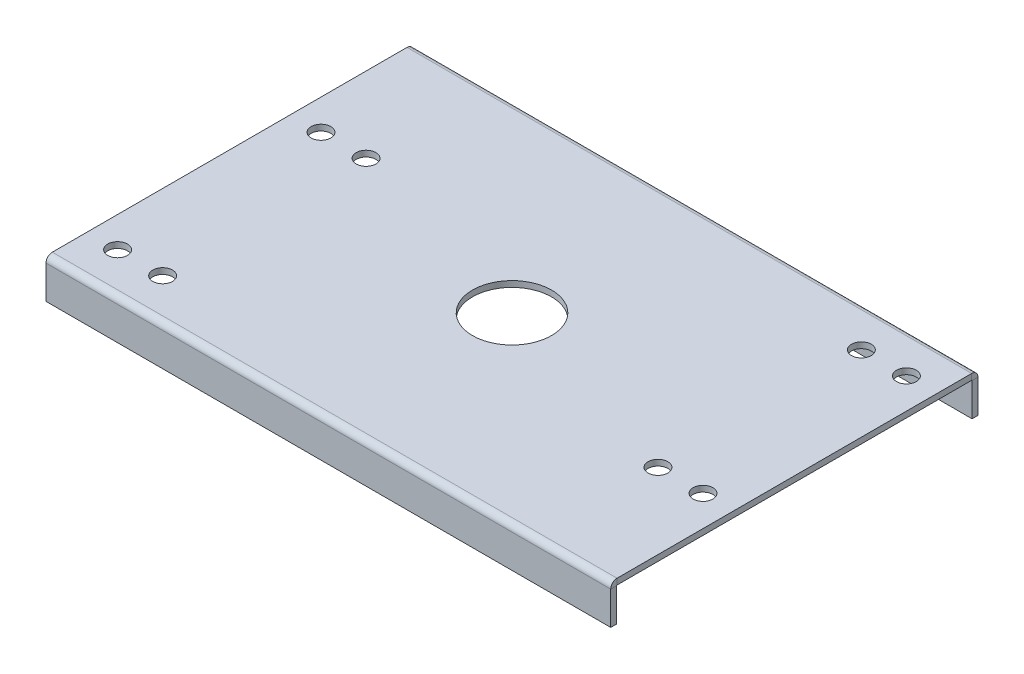
ISO-10303-21;
HEADER;
FILE_DESCRIPTION(('STEP AP214'),'2;1');
FILE_NAME('part.step','',(''),(''),'','','');
FILE_SCHEMA(('AUTOMOTIVE_DESIGN { 1 0 10303 214 1 1 1 1 }'));
ENDSEC;
DATA;
#1=APPLICATION_CONTEXT('core data for automotive mechanical design processes');
#2=APPLICATION_PROTOCOL_DEFINITION('international standard','automotive_design',2000,#1);
#3=PRODUCT_CONTEXT('',#1,'mechanical');
#4=PRODUCT('Part','Part','',(#3));
#5=PRODUCT_RELATED_PRODUCT_CATEGORY('part','',(#4));
#6=PRODUCT_DEFINITION_FORMATION('','',#4);
#7=PRODUCT_DEFINITION_CONTEXT('part definition',#1,'design');
#8=PRODUCT_DEFINITION('design','',#6,#7);
#9=PRODUCT_DEFINITION_SHAPE('','',#8);
#10=(LENGTH_UNIT() NAMED_UNIT(*) SI_UNIT(.MILLI.,.METRE.));
#11=(NAMED_UNIT(*) PLANE_ANGLE_UNIT() SI_UNIT($,.RADIAN.));
#12=(NAMED_UNIT(*) SI_UNIT($,.STERADIAN.) SOLID_ANGLE_UNIT());
#13=UNCERTAINTY_MEASURE_WITH_UNIT(LENGTH_MEASURE(1.E-05),#10,'distance_accuracy_value','');
#14=(GEOMETRIC_REPRESENTATION_CONTEXT(3) GLOBAL_UNCERTAINTY_ASSIGNED_CONTEXT((#13)) GLOBAL_UNIT_ASSIGNED_CONTEXT((#10,
#11,#12)) REPRESENTATION_CONTEXT('',''));
#15=CARTESIAN_POINT('',(0.,0.,0.));
#16=DIRECTION('',(0.,0.,1.));
#17=DIRECTION('',(1.,0.,0.));
#18=AXIS2_PLACEMENT_3D('',#15,#16,#17);
#19=CARTESIAN_POINT('',(0.,-1.5,0.));
#20=DIRECTION('',(0.,-1.,0.));
#21=DIRECTION('',(0.,0.,-1.));
#22=AXIS2_PLACEMENT_3D('',#19,#20,#21);
#23=PLANE('',#22);
#24=CARTESIAN_POINT('',(-63.775,-1.5,36.1));
#25=DIRECTION('',(0.,1.,0.));
#26=DIRECTION('',(0.,0.,1.));
#27=AXIS2_PLACEMENT_3D('',#24,#25,#26);
#28=CIRCLE('',#27,2.5);
#29=CARTESIAN_POINT('',(-63.775,-1.5,38.6));
#30=VERTEX_POINT('',#29);
#31=EDGE_CURVE('E398',#30,#30,#28,.T.);
#32=ORIENTED_EDGE('',*,*,#31,.T.);
#33=EDGE_LOOP('',(#32));
#34=FACE_BOUND('',#33,.T.);
#35=CARTESIAN_POINT('',(52.3650000000005,-1.5,15.41));
#36=DIRECTION('',(0.,1.,0.));
#37=DIRECTION('',(0.,0.,1.));
#38=AXIS2_PLACEMENT_3D('',#35,#36,#37);
#39=CIRCLE('',#38,2.5);
#40=CARTESIAN_POINT('',(52.3650000000005,-1.5,17.91));
#41=VERTEX_POINT('',#40);
#42=EDGE_CURVE('E387',#41,#41,#39,.T.);
#43=ORIENTED_EDGE('',*,*,#42,.T.);
#44=EDGE_LOOP('',(#43));
#45=FACE_BOUND('',#44,.T.);
#46=CARTESIAN_POINT('',(63.7750000000005,-1.5,15.41));
#47=DIRECTION('',(0.,1.,0.));
#48=DIRECTION('',(0.,0.,1.));
#49=AXIS2_PLACEMENT_3D('',#46,#47,#48);
#50=CIRCLE('',#49,2.50000000000001);
#51=CARTESIAN_POINT('',(63.7750000000005,-1.5,17.91));
#52=VERTEX_POINT('',#51);
#53=EDGE_CURVE('E386',#52,#52,#50,.T.);
#54=ORIENTED_EDGE('',*,*,#53,.T.);
#55=EDGE_LOOP('',(#54));
#56=FACE_BOUND('',#55,.T.);
#57=CARTESIAN_POINT('',(52.365,-1.5,-36.1));
#58=DIRECTION('',(0.,1.,0.));
#59=DIRECTION('',(0.,0.,1.));
#60=AXIS2_PLACEMENT_3D('',#57,#58,#59);
#61=CIRCLE('',#60,2.5);
#62=CARTESIAN_POINT('',(52.365,-1.5,-33.6));
#63=VERTEX_POINT('',#62);
#64=EDGE_CURVE('E380',#63,#63,#61,.T.);
#65=ORIENTED_EDGE('',*,*,#64,.T.);
#66=EDGE_LOOP('',(#65));
#67=FACE_BOUND('',#66,.T.);
#68=CARTESIAN_POINT('',(-52.3650000000002,-1.5,-15.41));
#69=DIRECTION('',(0.,1.,0.));
#70=DIRECTION('',(0.,0.,1.));
#71=AXIS2_PLACEMENT_3D('',#68,#69,#70);
#72=CIRCLE('',#71,2.5);
#73=CARTESIAN_POINT('',(-52.3650000000002,-1.5,-12.91));
#74=VERTEX_POINT('',#73);
#75=EDGE_CURVE('E410',#74,#74,#72,.T.);
#76=ORIENTED_EDGE('',*,*,#75,.T.);
#77=EDGE_LOOP('',(#76));
#78=FACE_BOUND('',#77,.T.);
#79=CARTESIAN_POINT('',(-63.7750000000002,-1.5,-15.41));
#80=DIRECTION('',(0.,1.,0.));
#81=DIRECTION('',(0.,0.,1.));
#82=AXIS2_PLACEMENT_3D('',#79,#80,#81);
#83=CIRCLE('',#82,2.5);
#84=CARTESIAN_POINT('',(-63.7750000000002,-1.5,-12.91));
#85=VERTEX_POINT('',#84);
#86=EDGE_CURVE('E409',#85,#85,#83,.T.);
#87=ORIENTED_EDGE('',*,*,#86,.T.);
#88=EDGE_LOOP('',(#87));
#89=FACE_BOUND('',#88,.T.);
#90=CARTESIAN_POINT('',(-52.365,-1.5,36.1));
#91=DIRECTION('',(0.,1.,0.));
#92=DIRECTION('',(0.,0.,1.));
#93=AXIS2_PLACEMENT_3D('',#90,#91,#92);
#94=CIRCLE('',#93,2.5);
#95=CARTESIAN_POINT('',(-52.365,-1.5,38.6));
#96=VERTEX_POINT('',#95);
#97=EDGE_CURVE('E399',#96,#96,#94,.T.);
#98=ORIENTED_EDGE('',*,*,#97,.T.);
#99=EDGE_LOOP('',(#98));
#100=FACE_BOUND('',#99,.T.);
#101=CARTESIAN_POINT('',(63.775,-1.5,-36.1));
#102=DIRECTION('',(0.,1.,0.));
#103=DIRECTION('',(0.,0.,1.));
#104=AXIS2_PLACEMENT_3D('',#101,#102,#103);
#105=CIRCLE('',#104,2.5);
#106=CARTESIAN_POINT('',(63.775,-1.5,-33.6));
#107=VERTEX_POINT('',#106);
#108=EDGE_CURVE('E374',#107,#107,#105,.T.);
#109=ORIENTED_EDGE('',*,*,#108,.T.);
#110=EDGE_LOOP('',(#109));
#111=FACE_BOUND('',#110,.T.);
#112=CARTESIAN_POINT('',(0.,-1.5,0.));
#113=DIRECTION('',(0.,1.,0.));
#114=DIRECTION('',(0.,0.,1.));
#115=AXIS2_PLACEMENT_3D('',#112,#113,#114);
#116=CIRCLE('',#115,10.);
#117=CARTESIAN_POINT('',(0.,-1.5,10.));
#118=VERTEX_POINT('',#117);
#119=EDGE_CURVE('E213',#118,#118,#116,.T.);
#120=ORIENTED_EDGE('',*,*,#119,.T.);
#121=EDGE_LOOP('',(#120));
#122=FACE_BOUND('',#121,.T.);
#123=DIRECTION('',(0.,0.,1.));
#124=VECTOR('',#123,1.);
#125=CARTESIAN_POINT('',(-71.5,-1.5,46.5));
#126=LINE('',#125,#124);
#127=CARTESIAN_POINT('',(-71.5,-1.5,-44.9));
#128=VERTEX_POINT('',#127);
#129=CARTESIAN_POINT('',(-71.5,-1.5,44.9));
#130=VERTEX_POINT('',#129);
#131=EDGE_CURVE('E13',#128,#130,#126,.T.);
#132=ORIENTED_EDGE('',*,*,#131,.F.);
#133=DIRECTION('',(1.,0.,0.));
#134=VECTOR('',#133,1.);
#135=CARTESIAN_POINT('',(71.5,-1.5,-44.9));
#136=LINE('',#135,#134);
#137=CARTESIAN_POINT('',(71.5,-1.5,-44.9));
#138=VERTEX_POINT('',#137);
#139=EDGE_CURVE('E226',#138,#128,#136,.F.);
#140=ORIENTED_EDGE('',*,*,#139,.F.);
#141=DIRECTION('',(0.,0.,-1.));
#142=VECTOR('',#141,1.);
#143=CARTESIAN_POINT('',(71.5,-1.5,46.5));
#144=LINE('',#143,#142);
#145=CARTESIAN_POINT('',(71.5,-1.5,44.9));
#146=VERTEX_POINT('',#145);
#147=EDGE_CURVE('E89',#146,#138,#144,.T.);
#148=ORIENTED_EDGE('',*,*,#147,.F.);
#149=DIRECTION('',(-1.,0.,0.));
#150=VECTOR('',#149,1.);
#151=CARTESIAN_POINT('',(-71.5,-1.5,44.9));
#152=LINE('',#151,#150);
#153=EDGE_CURVE('E280',#130,#146,#152,.F.);
#154=ORIENTED_EDGE('',*,*,#153,.F.);
#155=EDGE_LOOP('',(#132,#140,#148,#154));
#156=FACE_BOUND('',#155,.T.);
#157=ADVANCED_FACE('F80',(#34,#45,#56,#67,#78,#89,#100,#111,#122,#156),#23,.T.);
#158=CARTESIAN_POINT('',(0.,0.,0.));
#159=DIRECTION('',(0.,-1.,0.));
#160=DIRECTION('',(0.,0.,-1.));
#161=AXIS2_PLACEMENT_3D('',#158,#159,#160);
#162=PLANE('',#161);
#163=CARTESIAN_POINT('',(-63.775,0.,36.1));
#164=DIRECTION('',(0.,1.,0.));
#165=DIRECTION('',(0.,0.,1.));
#166=AXIS2_PLACEMENT_3D('',#163,#164,#165);
#167=CIRCLE('',#166,2.5);
#168=CARTESIAN_POINT('',(-63.775,0.,38.6));
#169=VERTEX_POINT('',#168);
#170=EDGE_CURVE('E395',#169,#169,#167,.T.);
#171=ORIENTED_EDGE('',*,*,#170,.F.);
#172=EDGE_LOOP('',(#171));
#173=FACE_BOUND('',#172,.T.);
#174=CARTESIAN_POINT('',(52.3650000000005,0.,15.41));
#175=DIRECTION('',(0.,1.,0.));
#176=DIRECTION('',(0.,0.,1.));
#177=AXIS2_PLACEMENT_3D('',#174,#175,#176);
#178=CIRCLE('',#177,2.5);
#179=CARTESIAN_POINT('',(52.3650000000005,0.,17.91));
#180=VERTEX_POINT('',#179);
#181=EDGE_CURVE('E401',#180,#180,#178,.T.);
#182=ORIENTED_EDGE('',*,*,#181,.F.);
#183=EDGE_LOOP('',(#182));
#184=FACE_BOUND('',#183,.T.);
#185=CARTESIAN_POINT('',(63.7750000000005,0.,15.41));
#186=DIRECTION('',(0.,1.,0.));
#187=DIRECTION('',(0.,0.,1.));
#188=AXIS2_PLACEMENT_3D('',#185,#186,#187);
#189=CIRCLE('',#188,2.50000000000001);
#190=CARTESIAN_POINT('',(63.7750000000005,0.,17.91));
#191=VERTEX_POINT('',#190);
#192=EDGE_CURVE('E383',#191,#191,#189,.T.);
#193=ORIENTED_EDGE('',*,*,#192,.F.);
#194=EDGE_LOOP('',(#193));
#195=FACE_BOUND('',#194,.T.);
#196=CARTESIAN_POINT('',(52.365,0.,-36.1));
#197=DIRECTION('',(0.,1.,0.));
#198=DIRECTION('',(0.,0.,1.));
#199=AXIS2_PLACEMENT_3D('',#196,#197,#198);
#200=CIRCLE('',#199,2.5);
#201=CARTESIAN_POINT('',(52.365,0.,-33.6));
#202=VERTEX_POINT('',#201);
#203=EDGE_CURVE('E390',#202,#202,#200,.T.);
#204=ORIENTED_EDGE('',*,*,#203,.F.);
#205=EDGE_LOOP('',(#204));
#206=FACE_BOUND('',#205,.T.);
#207=CARTESIAN_POINT('',(-52.3650000000002,0.,-15.41));
#208=DIRECTION('',(0.,1.,0.));
#209=DIRECTION('',(0.,0.,1.));
#210=AXIS2_PLACEMENT_3D('',#207,#208,#209);
#211=CIRCLE('',#210,2.5);
#212=CARTESIAN_POINT('',(-52.3650000000002,0.,-12.91));
#213=VERTEX_POINT('',#212);
#214=EDGE_CURVE('E418',#213,#213,#211,.T.);
#215=ORIENTED_EDGE('',*,*,#214,.F.);
#216=EDGE_LOOP('',(#215));
#217=FACE_BOUND('',#216,.T.);
#218=CARTESIAN_POINT('',(-63.7750000000002,0.,-15.41));
#219=DIRECTION('',(0.,1.,0.));
#220=DIRECTION('',(0.,0.,1.));
#221=AXIS2_PLACEMENT_3D('',#218,#219,#220);
#222=CIRCLE('',#221,2.5);
#223=CARTESIAN_POINT('',(-63.7750000000002,0.,-12.91));
#224=VERTEX_POINT('',#223);
#225=EDGE_CURVE('E406',#224,#224,#222,.T.);
#226=ORIENTED_EDGE('',*,*,#225,.F.);
#227=EDGE_LOOP('',(#226));
#228=FACE_BOUND('',#227,.T.);
#229=CARTESIAN_POINT('',(-52.365,0.,36.1));
#230=DIRECTION('',(0.,1.,0.));
#231=DIRECTION('',(0.,0.,1.));
#232=AXIS2_PLACEMENT_3D('',#229,#230,#231);
#233=CIRCLE('',#232,2.5);
#234=CARTESIAN_POINT('',(-52.365,0.,38.6));
#235=VERTEX_POINT('',#234);
#236=EDGE_CURVE('E413',#235,#235,#233,.T.);
#237=ORIENTED_EDGE('',*,*,#236,.F.);
#238=EDGE_LOOP('',(#237));
#239=FACE_BOUND('',#238,.T.);
#240=CARTESIAN_POINT('',(63.775,0.,-36.1));
#241=DIRECTION('',(0.,1.,0.));
#242=DIRECTION('',(0.,0.,1.));
#243=AXIS2_PLACEMENT_3D('',#240,#241,#242);
#244=CIRCLE('',#243,2.5);
#245=CARTESIAN_POINT('',(63.775,0.,-33.6));
#246=VERTEX_POINT('',#245);
#247=EDGE_CURVE('E377',#246,#246,#244,.T.);
#248=ORIENTED_EDGE('',*,*,#247,.F.);
#249=EDGE_LOOP('',(#248));
#250=FACE_BOUND('',#249,.T.);
#251=CARTESIAN_POINT('',(0.,0.,0.));
#252=DIRECTION('',(0.,1.,0.));
#253=DIRECTION('',(0.,0.,1.));
#254=AXIS2_PLACEMENT_3D('',#251,#252,#253);
#255=CIRCLE('',#254,10.);
#256=CARTESIAN_POINT('',(0.,0.,10.));
#257=VERTEX_POINT('',#256);
#258=EDGE_CURVE('E371',#257,#257,#255,.T.);
#259=ORIENTED_EDGE('',*,*,#258,.F.);
#260=EDGE_LOOP('',(#259));
#261=FACE_BOUND('',#260,.T.);
#262=DIRECTION('',(1.,0.,0.));
#263=VECTOR('',#262,1.);
#264=CARTESIAN_POINT('',(71.5,0.,-44.9));
#265=LINE('',#264,#263);
#266=CARTESIAN_POINT('',(71.5,0.,-44.9));
#267=VERTEX_POINT('',#266);
#268=CARTESIAN_POINT('',(-71.5,0.,-44.9));
#269=VERTEX_POINT('',#268);
#270=EDGE_CURVE('E214',#267,#269,#265,.F.);
#271=ORIENTED_EDGE('',*,*,#270,.T.);
#272=DIRECTION('',(0.,0.,1.));
#273=VECTOR('',#272,1.);
#274=CARTESIAN_POINT('',(-71.5,0.,46.5));
#275=LINE('',#274,#273);
#276=CARTESIAN_POINT('',(-71.5,0.,44.9));
#277=VERTEX_POINT('',#276);
#278=EDGE_CURVE('E84',#269,#277,#275,.T.);
#279=ORIENTED_EDGE('',*,*,#278,.T.);
#280=DIRECTION('',(-1.,0.,0.));
#281=VECTOR('',#280,1.);
#282=CARTESIAN_POINT('',(-71.5,0.,44.9));
#283=LINE('',#282,#281);
#284=CARTESIAN_POINT('',(71.5,0.,44.9));
#285=VERTEX_POINT('',#284);
#286=EDGE_CURVE('E268',#277,#285,#283,.F.);
#287=ORIENTED_EDGE('',*,*,#286,.T.);
#288=DIRECTION('',(0.,0.,-1.));
#289=VECTOR('',#288,1.);
#290=CARTESIAN_POINT('',(71.5,0.,46.5));
#291=LINE('',#290,#289);
#292=EDGE_CURVE('E286',#285,#267,#291,.T.);
#293=ORIENTED_EDGE('',*,*,#292,.T.);
#294=EDGE_LOOP('',(#271,#279,#287,#293));
#295=FACE_BOUND('',#294,.T.);
#296=ADVANCED_FACE('F292',(#173,#184,#195,#206,#217,#228,#239,#250,#261,#295),#162,.F.);
#297=CARTESIAN_POINT('',(71.5,-1.5,46.5));
#298=DIRECTION('',(1.,0.,0.));
#299=DIRECTION('',(0.,0.,-1.));
#300=AXIS2_PLACEMENT_3D('',#297,#298,#299);
#301=PLANE('',#300);
#302=ORIENTED_EDGE('',*,*,#147,.T.);
#303=DIRECTION('',(0.,1.,0.));
#304=VECTOR('',#303,1.);
#305=CARTESIAN_POINT('',(71.5,-1.5,-44.9));
#306=LINE('',#305,#304);
#307=EDGE_CURVE('E220',#138,#267,#306,.T.);
#308=ORIENTED_EDGE('',*,*,#307,.T.);
#309=ORIENTED_EDGE('',*,*,#292,.F.);
#310=DIRECTION('',(0.,1.,0.));
#311=VECTOR('',#310,1.);
#312=CARTESIAN_POINT('',(71.5,-1.5,44.9));
#313=LINE('',#312,#311);
#314=EDGE_CURVE('E103',#146,#285,#313,.T.);
#315=ORIENTED_EDGE('',*,*,#314,.F.);
#316=EDGE_LOOP('',(#302,#308,#309,#315));
#317=FACE_BOUND('',#316,.T.);
#318=ADVANCED_FACE('F82',(#317),#301,.T.);
#319=CARTESIAN_POINT('',(-71.5,-1.5,46.5));
#320=DIRECTION('',(-1.,0.,0.));
#321=DIRECTION('',(0.,0.,1.));
#322=AXIS2_PLACEMENT_3D('',#319,#320,#321);
#323=PLANE('',#322);
#324=DIRECTION('',(0.,1.,0.));
#325=VECTOR('',#324,1.);
#326=CARTESIAN_POINT('',(-71.5,-1.5,-44.9));
#327=LINE('',#326,#325);
#328=EDGE_CURVE('E232',#128,#269,#327,.T.);
#329=ORIENTED_EDGE('',*,*,#328,.F.);
#330=ORIENTED_EDGE('',*,*,#131,.T.);
#331=DIRECTION('',(0.,1.,0.));
#332=VECTOR('',#331,1.);
#333=CARTESIAN_POINT('',(-71.5,-1.5,44.9));
#334=LINE('',#333,#332);
#335=EDGE_CURVE('E274',#130,#277,#334,.T.);
#336=ORIENTED_EDGE('',*,*,#335,.T.);
#337=ORIENTED_EDGE('',*,*,#278,.F.);
#338=EDGE_LOOP('',(#329,#330,#336,#337));
#339=FACE_BOUND('',#338,.T.);
#340=ADVANCED_FACE('F350',(#339),#323,.T.);
#341=CARTESIAN_POINT('',(71.5,-1.6,44.9));
#342=DIRECTION('',(1.,0.,0.));
#343=DIRECTION('',(0.,0.,-1.));
#344=AXIS2_PLACEMENT_3D('',#341,#342,#343);
#345=PLANE('',#344);
#346=DIRECTION('',(0.,0.,-1.));
#347=VECTOR('',#346,1.);
#348=CARTESIAN_POINT('',(71.5,-1.6,46.5));
#349=LINE('',#348,#347);
#350=CARTESIAN_POINT('',(71.5,-1.6,45.));
#351=VERTEX_POINT('',#350);
#352=CARTESIAN_POINT('',(71.5,-1.6,46.5));
#353=VERTEX_POINT('',#352);
#354=EDGE_CURVE('E235',#351,#353,#349,.F.);
#355=ORIENTED_EDGE('',*,*,#354,.F.);
#356=CARTESIAN_POINT('',(71.5,-1.6,44.9));
#357=DIRECTION('',(-1.,0.,0.));
#358=DIRECTION('',(0.,0.,1.));
#359=AXIS2_PLACEMENT_3D('',#356,#357,#358);
#360=CIRCLE('',#359,0.100000000000003);
#361=EDGE_CURVE('E277',#146,#351,#360,.F.);
#362=ORIENTED_EDGE('',*,*,#361,.F.);
#363=ORIENTED_EDGE('',*,*,#314,.T.);
#364=CARTESIAN_POINT('',(71.5,-1.6,44.9));
#365=DIRECTION('',(-1.,0.,0.));
#366=DIRECTION('',(0.,0.,1.));
#367=AXIS2_PLACEMENT_3D('',#364,#365,#366);
#368=CIRCLE('',#367,1.6);
#369=EDGE_CURVE('E270',#285,#353,#368,.F.);
#370=ORIENTED_EDGE('',*,*,#369,.T.);
#371=EDGE_LOOP('',(#355,#362,#363,#370));
#372=FACE_BOUND('',#371,.T.);
#373=ADVANCED_FACE('F321',(#372),#345,.T.);
#374=CARTESIAN_POINT('',(-71.5,-1.6,44.9));
#375=DIRECTION('',(1.,0.,0.));
#376=DIRECTION('',(0.,0.,-1.));
#377=AXIS2_PLACEMENT_3D('',#374,#375,#376);
#378=PLANE('',#377);
#379=CARTESIAN_POINT('',(-71.5,-1.6,44.9));
#380=DIRECTION('',(-1.,0.,0.));
#381=DIRECTION('',(0.,0.,1.));
#382=AXIS2_PLACEMENT_3D('',#379,#380,#381);
#383=CIRCLE('',#382,0.100000000000003);
#384=CARTESIAN_POINT('',(-71.5,-1.6,45.));
#385=VERTEX_POINT('',#384);
#386=EDGE_CURVE('E241',#385,#130,#383,.T.);
#387=ORIENTED_EDGE('',*,*,#386,.F.);
#388=DIRECTION('',(0.,0.,-1.));
#389=VECTOR('',#388,1.);
#390=CARTESIAN_POINT('',(-71.5,-1.6,45.));
#391=LINE('',#390,#389);
#392=CARTESIAN_POINT('',(-71.5,-1.6,46.5));
#393=VERTEX_POINT('',#392);
#394=EDGE_CURVE('E261',#385,#393,#391,.F.);
#395=ORIENTED_EDGE('',*,*,#394,.T.);
#396=CARTESIAN_POINT('',(-71.5,-1.6,44.9));
#397=DIRECTION('',(-1.,0.,0.));
#398=DIRECTION('',(0.,0.,1.));
#399=AXIS2_PLACEMENT_3D('',#396,#397,#398);
#400=CIRCLE('',#399,1.6);
#401=EDGE_CURVE('E271',#393,#277,#400,.T.);
#402=ORIENTED_EDGE('',*,*,#401,.T.);
#403=ORIENTED_EDGE('',*,*,#335,.F.);
#404=EDGE_LOOP('',(#387,#395,#402,#403));
#405=FACE_BOUND('',#404,.T.);
#406=ADVANCED_FACE('F300',(#405),#378,.F.);
#407=CARTESIAN_POINT('',(-71.5,-1.6,44.9));
#408=DIRECTION('',(-1.,0.,0.));
#409=DIRECTION('',(0.,0.,1.));
#410=AXIS2_PLACEMENT_3D('',#407,#408,#409);
#411=CYLINDRICAL_SURFACE('',#410,1.6);
#412=ORIENTED_EDGE('',*,*,#286,.F.);
#413=ORIENTED_EDGE('',*,*,#401,.F.);
#414=DIRECTION('',(-1.,0.,0.));
#415=VECTOR('',#414,1.);
#416=CARTESIAN_POINT('',(71.5,-1.6,46.5));
#417=LINE('',#416,#415);
#418=EDGE_CURVE('E259',#393,#353,#417,.F.);
#419=ORIENTED_EDGE('',*,*,#418,.T.);
#420=ORIENTED_EDGE('',*,*,#369,.F.);
#421=EDGE_LOOP('',(#412,#413,#419,#420));
#422=FACE_BOUND('',#421,.T.);
#423=ADVANCED_FACE('F296',(#422),#411,.T.);
#424=CARTESIAN_POINT('',(-71.5,-1.6,44.9));
#425=DIRECTION('',(-1.,0.,0.));
#426=DIRECTION('',(0.,0.,1.));
#427=AXIS2_PLACEMENT_3D('',#424,#425,#426);
#428=CYLINDRICAL_SURFACE('',#427,0.100000000000003);
#429=ORIENTED_EDGE('',*,*,#153,.T.);
#430=ORIENTED_EDGE('',*,*,#361,.T.);
#431=DIRECTION('',(-1.,0.,0.));
#432=VECTOR('',#431,1.);
#433=CARTESIAN_POINT('',(71.5,-1.6,45.));
#434=LINE('',#433,#432);
#435=EDGE_CURVE('E264',#351,#385,#434,.T.);
#436=ORIENTED_EDGE('',*,*,#435,.T.);
#437=ORIENTED_EDGE('',*,*,#386,.T.);
#438=EDGE_LOOP('',(#429,#430,#436,#437));
#439=FACE_BOUND('',#438,.T.);
#440=ADVANCED_FACE('F324',(#439),#428,.F.);
#441=CARTESIAN_POINT('',(-71.5,-10.,46.5));
#442=DIRECTION('',(1.,0.,0.));
#443=DIRECTION('',(0.,1.,0.));
#444=AXIS2_PLACEMENT_3D('',#441,#442,#443);
#445=PLANE('',#444);
#446=ORIENTED_EDGE('',*,*,#394,.F.);
#447=DIRECTION('',(0.,1.,0.));
#448=VECTOR('',#447,1.);
#449=CARTESIAN_POINT('',(-71.5,-10.,45.));
#450=LINE('',#449,#448);
#451=CARTESIAN_POINT('',(-71.5,-10.,45.));
#452=VERTEX_POINT('',#451);
#453=EDGE_CURVE('E257',#385,#452,#450,.F.);
#454=ORIENTED_EDGE('',*,*,#453,.T.);
#455=DIRECTION('',(0.,0.,-1.));
#456=VECTOR('',#455,1.);
#457=CARTESIAN_POINT('',(-71.5,-10.,46.5));
#458=LINE('',#457,#456);
#459=CARTESIAN_POINT('',(-71.5,-10.,46.5));
#460=VERTEX_POINT('',#459);
#461=EDGE_CURVE('E238',#460,#452,#458,.T.);
#462=ORIENTED_EDGE('',*,*,#461,.F.);
#463=DIRECTION('',(0.,-1.,0.));
#464=VECTOR('',#463,1.);
#465=CARTESIAN_POINT('',(-71.5,2.73813233112438E-13,46.5));
#466=LINE('',#465,#464);
#467=EDGE_CURVE('E250',#393,#460,#466,.T.);
#468=ORIENTED_EDGE('',*,*,#467,.F.);
#469=EDGE_LOOP('',(#446,#454,#462,#468));
#470=FACE_BOUND('',#469,.T.);
#471=ADVANCED_FACE('F310',(#470),#445,.F.);
#472=CARTESIAN_POINT('',(71.5,-1.49999999999999,46.5));
#473=DIRECTION('',(-1.,0.,0.));
#474=DIRECTION('',(0.,-1.,0.));
#475=AXIS2_PLACEMENT_3D('',#472,#473,#474);
#476=PLANE('',#475);
#477=ORIENTED_EDGE('',*,*,#354,.T.);
#478=DIRECTION('',(0.,1.,0.));
#479=VECTOR('',#478,1.);
#480=CARTESIAN_POINT('',(71.5,0.,46.5));
#481=LINE('',#480,#479);
#482=CARTESIAN_POINT('',(71.5,-10.,46.5));
#483=VERTEX_POINT('',#482);
#484=EDGE_CURVE('E245',#483,#353,#481,.T.);
#485=ORIENTED_EDGE('',*,*,#484,.F.);
#486=DIRECTION('',(0.,0.,-1.));
#487=VECTOR('',#486,1.);
#488=CARTESIAN_POINT('',(71.5,-10.,46.5));
#489=LINE('',#488,#487);
#490=CARTESIAN_POINT('',(71.5,-10.,45.));
#491=VERTEX_POINT('',#490);
#492=EDGE_CURVE('E242',#483,#491,#489,.T.);
#493=ORIENTED_EDGE('',*,*,#492,.T.);
#494=DIRECTION('',(0.,-1.,0.));
#495=VECTOR('',#494,1.);
#496=CARTESIAN_POINT('',(71.5,-1.5,45.));
#497=LINE('',#496,#495);
#498=EDGE_CURVE('E252',#491,#351,#497,.F.);
#499=ORIENTED_EDGE('',*,*,#498,.T.);
#500=EDGE_LOOP('',(#477,#485,#493,#499));
#501=FACE_BOUND('',#500,.T.);
#502=ADVANCED_FACE('F318',(#501),#476,.F.);
#503=CARTESIAN_POINT('',(0.,1.5707654743494E-13,46.5));
#504=DIRECTION('',(0.,0.,-1.));
#505=DIRECTION('',(0.,1.,0.));
#506=AXIS2_PLACEMENT_3D('',#503,#504,#505);
#507=PLANE('',#506);
#508=ORIENTED_EDGE('',*,*,#418,.F.);
#509=ORIENTED_EDGE('',*,*,#467,.T.);
#510=DIRECTION('',(1.,0.,0.));
#511=VECTOR('',#510,1.);
#512=CARTESIAN_POINT('',(0.,-10.,46.5));
#513=LINE('',#512,#511);
#514=EDGE_CURVE('E248',#460,#483,#513,.T.);
#515=ORIENTED_EDGE('',*,*,#514,.T.);
#516=ORIENTED_EDGE('',*,*,#484,.T.);
#517=EDGE_LOOP('',(#508,#509,#515,#516));
#518=FACE_BOUND('',#517,.T.);
#519=ADVANCED_FACE('F307',(#518),#507,.F.);
#520=CARTESIAN_POINT('',(0.,1.51839325426676E-13,45.));
#521=DIRECTION('',(0.,0.,-1.));
#522=DIRECTION('',(0.,1.,0.));
#523=AXIS2_PLACEMENT_3D('',#520,#521,#522);
#524=PLANE('',#523);
#525=ORIENTED_EDGE('',*,*,#453,.F.);
#526=ORIENTED_EDGE('',*,*,#435,.F.);
#527=ORIENTED_EDGE('',*,*,#498,.F.);
#528=DIRECTION('',(-1.,0.,0.));
#529=VECTOR('',#528,1.);
#530=CARTESIAN_POINT('',(71.5,-10.,45.));
#531=LINE('',#530,#529);
#532=EDGE_CURVE('E255',#452,#491,#531,.F.);
#533=ORIENTED_EDGE('',*,*,#532,.F.);
#534=EDGE_LOOP('',(#525,#526,#527,#533));
#535=FACE_BOUND('',#534,.T.);
#536=ADVANCED_FACE('F326',(#535),#524,.T.);
#537=CARTESIAN_POINT('',(71.5,-10.,46.5));
#538=DIRECTION('',(0.,1.,0.));
#539=DIRECTION('',(0.,0.,1.));
#540=AXIS2_PLACEMENT_3D('',#537,#538,#539);
#541=PLANE('',#540);
#542=ORIENTED_EDGE('',*,*,#532,.T.);
#543=ORIENTED_EDGE('',*,*,#492,.F.);
#544=ORIENTED_EDGE('',*,*,#514,.F.);
#545=ORIENTED_EDGE('',*,*,#461,.T.);
#546=EDGE_LOOP('',(#542,#543,#544,#545));
#547=FACE_BOUND('',#546,.T.);
#548=ADVANCED_FACE('F315',(#547),#541,.F.);
#549=CARTESIAN_POINT('',(-71.5,-1.6,-44.9));
#550=DIRECTION('',(-1.,0.,0.));
#551=DIRECTION('',(0.,0.,1.));
#552=AXIS2_PLACEMENT_3D('',#549,#550,#551);
#553=PLANE('',#552);
#554=DIRECTION('',(0.,0.,1.));
#555=VECTOR('',#554,1.);
#556=CARTESIAN_POINT('',(-71.5,-1.59999999999999,-46.5));
#557=LINE('',#556,#555);
#558=CARTESIAN_POINT('',(-71.5,-1.6,-45.));
#559=VERTEX_POINT('',#558);
#560=CARTESIAN_POINT('',(-71.5,-1.6,-46.5));
#561=VERTEX_POINT('',#560);
#562=EDGE_CURVE('E195',#559,#561,#557,.F.);
#563=ORIENTED_EDGE('',*,*,#562,.F.);
#564=CARTESIAN_POINT('',(-71.5,-1.6,-44.9));
#565=DIRECTION('',(1.,0.,0.));
#566=DIRECTION('',(0.,0.,-1.));
#567=AXIS2_PLACEMENT_3D('',#564,#565,#566);
#568=CIRCLE('',#567,0.100000000000003);
#569=EDGE_CURVE('E223',#128,#559,#568,.F.);
#570=ORIENTED_EDGE('',*,*,#569,.F.);
#571=ORIENTED_EDGE('',*,*,#328,.T.);
#572=CARTESIAN_POINT('',(-71.5,-1.6,-44.9));
#573=DIRECTION('',(1.,0.,0.));
#574=DIRECTION('',(0.,0.,-1.));
#575=AXIS2_PLACEMENT_3D('',#572,#573,#574);
#576=CIRCLE('',#575,1.6);
#577=EDGE_CURVE('E216',#269,#561,#576,.F.);
#578=ORIENTED_EDGE('',*,*,#577,.T.);
#579=EDGE_LOOP('',(#563,#570,#571,#578));
#580=FACE_BOUND('',#579,.T.);
#581=ADVANCED_FACE('F333',(#580),#553,.T.);
#582=CARTESIAN_POINT('',(71.5,-1.6,-44.9));
#583=DIRECTION('',(-1.,0.,0.));
#584=DIRECTION('',(0.,0.,1.));
#585=AXIS2_PLACEMENT_3D('',#582,#583,#584);
#586=PLANE('',#585);
#587=CARTESIAN_POINT('',(71.5,-1.6,-44.9));
#588=DIRECTION('',(1.,0.,0.));
#589=DIRECTION('',(0.,0.,-1.));
#590=AXIS2_PLACEMENT_3D('',#587,#588,#589);
#591=CIRCLE('',#590,0.100000000000003);
#592=CARTESIAN_POINT('',(71.5,-1.6,-45.));
#593=VERTEX_POINT('',#592);
#594=EDGE_CURVE('E229',#593,#138,#591,.T.);
#595=ORIENTED_EDGE('',*,*,#594,.F.);
#596=DIRECTION('',(0.,0.,1.));
#597=VECTOR('',#596,1.);
#598=CARTESIAN_POINT('',(71.5,-1.6,-45.));
#599=LINE('',#598,#597);
#600=CARTESIAN_POINT('',(71.5,-1.59999999999999,-46.5));
#601=VERTEX_POINT('',#600);
#602=EDGE_CURVE('E207',#593,#601,#599,.F.);
#603=ORIENTED_EDGE('',*,*,#602,.T.);
#604=CARTESIAN_POINT('',(71.5,-1.6,-44.9));
#605=DIRECTION('',(1.,0.,0.));
#606=DIRECTION('',(0.,0.,-1.));
#607=AXIS2_PLACEMENT_3D('',#604,#605,#606);
#608=CIRCLE('',#607,1.6);
#609=EDGE_CURVE('E217',#601,#267,#608,.T.);
#610=ORIENTED_EDGE('',*,*,#609,.T.);
#611=ORIENTED_EDGE('',*,*,#307,.F.);
#612=EDGE_LOOP('',(#595,#603,#610,#611));
#613=FACE_BOUND('',#612,.T.);
#614=ADVANCED_FACE('F470',(#613),#586,.F.);
#615=CARTESIAN_POINT('',(71.5,-1.6,-44.9));
#616=DIRECTION('',(1.,0.,0.));
#617=DIRECTION('',(0.,0.,-1.));
#618=AXIS2_PLACEMENT_3D('',#615,#616,#617);
#619=CYLINDRICAL_SURFACE('',#618,1.6);
#620=ORIENTED_EDGE('',*,*,#270,.F.);
#621=ORIENTED_EDGE('',*,*,#609,.F.);
#622=DIRECTION('',(1.,0.,0.));
#623=VECTOR('',#622,1.);
#624=CARTESIAN_POINT('',(-71.5,-1.59999999999999,-46.5));
#625=LINE('',#624,#623);
#626=EDGE_CURVE('E205',#601,#561,#625,.F.);
#627=ORIENTED_EDGE('',*,*,#626,.T.);
#628=ORIENTED_EDGE('',*,*,#577,.F.);
#629=EDGE_LOOP('',(#620,#621,#627,#628));
#630=FACE_BOUND('',#629,.T.);
#631=ADVANCED_FACE('F365',(#630),#619,.T.);
#632=CARTESIAN_POINT('',(71.5,-1.6,-44.9));
#633=DIRECTION('',(1.,0.,0.));
#634=DIRECTION('',(0.,0.,-1.));
#635=AXIS2_PLACEMENT_3D('',#632,#633,#634);
#636=CYLINDRICAL_SURFACE('',#635,0.100000000000003);
#637=ORIENTED_EDGE('',*,*,#139,.T.);
#638=ORIENTED_EDGE('',*,*,#569,.T.);
#639=DIRECTION('',(1.,0.,0.));
#640=VECTOR('',#639,1.);
#641=CARTESIAN_POINT('',(-71.5,-1.6,-45.));
#642=LINE('',#641,#640);
#643=EDGE_CURVE('E210',#559,#593,#642,.T.);
#644=ORIENTED_EDGE('',*,*,#643,.T.);
#645=ORIENTED_EDGE('',*,*,#594,.T.);
#646=EDGE_LOOP('',(#637,#638,#644,#645));
#647=FACE_BOUND('',#646,.T.);
#648=ADVANCED_FACE('F361',(#647),#636,.F.);
#649=CARTESIAN_POINT('',(71.5,-10.,-46.5));
#650=DIRECTION('',(-1.,0.,0.));
#651=DIRECTION('',(0.,-1.,0.));
#652=AXIS2_PLACEMENT_3D('',#649,#650,#651);
#653=PLANE('',#652);
#654=ORIENTED_EDGE('',*,*,#602,.F.);
#655=DIRECTION('',(0.,1.,0.));
#656=VECTOR('',#655,1.);
#657=CARTESIAN_POINT('',(71.5,-10.,-45.));
#658=LINE('',#657,#656);
#659=CARTESIAN_POINT('',(71.5,-10.,-45.));
#660=VERTEX_POINT('',#659);
#661=EDGE_CURVE('E203',#593,#660,#658,.F.);
#662=ORIENTED_EDGE('',*,*,#661,.T.);
#663=DIRECTION('',(0.,0.,1.));
#664=VECTOR('',#663,1.);
#665=CARTESIAN_POINT('',(71.5,-10.,-46.5));
#666=LINE('',#665,#664);
#667=CARTESIAN_POINT('',(71.5,-10.,-46.5));
#668=VERTEX_POINT('',#667);
#669=EDGE_CURVE('E191',#668,#660,#666,.T.);
#670=ORIENTED_EDGE('',*,*,#669,.F.);
#671=DIRECTION('',(0.,-1.,0.));
#672=VECTOR('',#671,1.);
#673=CARTESIAN_POINT('',(71.5,0.,-46.5));
#674=LINE('',#673,#672);
#675=EDGE_CURVE('E178',#601,#668,#674,.T.);
#676=ORIENTED_EDGE('',*,*,#675,.F.);
#677=EDGE_LOOP('',(#654,#662,#670,#676));
#678=FACE_BOUND('',#677,.T.);
#679=ADVANCED_FACE('F368',(#678),#653,.F.);
#680=CARTESIAN_POINT('',(-71.5,-1.49999999999999,-46.5));
#681=DIRECTION('',(1.,0.,0.));
#682=DIRECTION('',(0.,1.,0.));
#683=AXIS2_PLACEMENT_3D('',#680,#681,#682);
#684=PLANE('',#683);
#685=ORIENTED_EDGE('',*,*,#562,.T.);
#686=DIRECTION('',(0.,1.,0.));
#687=VECTOR('',#686,1.);
#688=CARTESIAN_POINT('',(-71.5,2.73813233112438E-13,-46.5));
#689=LINE('',#688,#687);
#690=CARTESIAN_POINT('',(-71.5,-10.,-46.5));
#691=VERTEX_POINT('',#690);
#692=EDGE_CURVE('E176',#691,#561,#689,.T.);
#693=ORIENTED_EDGE('',*,*,#692,.F.);
#694=DIRECTION('',(0.,0.,1.));
#695=VECTOR('',#694,1.);
#696=CARTESIAN_POINT('',(-71.5,-10.,-46.5));
#697=LINE('',#696,#695);
#698=CARTESIAN_POINT('',(-71.5,-10.,-45.));
#699=VERTEX_POINT('',#698);
#700=EDGE_CURVE('E184',#691,#699,#697,.T.);
#701=ORIENTED_EDGE('',*,*,#700,.T.);
#702=DIRECTION('',(0.,-1.,0.));
#703=VECTOR('',#702,1.);
#704=CARTESIAN_POINT('',(-71.5,-1.5,-45.));
#705=LINE('',#704,#703);
#706=EDGE_CURVE('E200',#699,#559,#705,.F.);
#707=ORIENTED_EDGE('',*,*,#706,.T.);
#708=EDGE_LOOP('',(#685,#693,#701,#707));
#709=FACE_BOUND('',#708,.T.);
#710=ADVANCED_FACE('F194',(#709),#684,.F.);
#711=CARTESIAN_POINT('',(0.,1.5707654743494E-13,-46.5));
#712=DIRECTION('',(0.,0.,1.));
#713=DIRECTION('',(0.,-1.,0.));
#714=AXIS2_PLACEMENT_3D('',#711,#712,#713);
#715=PLANE('',#714);
#716=ORIENTED_EDGE('',*,*,#626,.F.);
#717=ORIENTED_EDGE('',*,*,#675,.T.);
#718=DIRECTION('',(-1.,0.,0.));
#719=VECTOR('',#718,1.);
#720=CARTESIAN_POINT('',(0.,-10.,-46.5));
#721=LINE('',#720,#719);
#722=EDGE_CURVE('E171',#668,#691,#721,.T.);
#723=ORIENTED_EDGE('',*,*,#722,.T.);
#724=ORIENTED_EDGE('',*,*,#692,.T.);
#725=EDGE_LOOP('',(#716,#717,#723,#724));
#726=FACE_BOUND('',#725,.T.);
#727=ADVANCED_FACE('F174',(#726),#715,.F.);
#728=CARTESIAN_POINT('',(0.,1.51839325426676E-13,-45.));
#729=DIRECTION('',(0.,0.,1.));
#730=DIRECTION('',(0.,-1.,0.));
#731=AXIS2_PLACEMENT_3D('',#728,#729,#730);
#732=PLANE('',#731);
#733=ORIENTED_EDGE('',*,*,#661,.F.);
#734=ORIENTED_EDGE('',*,*,#643,.F.);
#735=ORIENTED_EDGE('',*,*,#706,.F.);
#736=DIRECTION('',(1.,0.,0.));
#737=VECTOR('',#736,1.);
#738=CARTESIAN_POINT('',(-71.5,-10.,-45.));
#739=LINE('',#738,#737);
#740=EDGE_CURVE('E187',#660,#699,#739,.F.);
#741=ORIENTED_EDGE('',*,*,#740,.F.);
#742=EDGE_LOOP('',(#733,#734,#735,#741));
#743=FACE_BOUND('',#742,.T.);
#744=ADVANCED_FACE('F454',(#743),#732,.T.);
#745=CARTESIAN_POINT('',(-71.5,-10.,-46.5));
#746=DIRECTION('',(0.,1.,0.));
#747=DIRECTION('',(0.,0.,1.));
#748=AXIS2_PLACEMENT_3D('',#745,#746,#747);
#749=PLANE('',#748);
#750=ORIENTED_EDGE('',*,*,#740,.T.);
#751=ORIENTED_EDGE('',*,*,#700,.F.);
#752=ORIENTED_EDGE('',*,*,#722,.F.);
#753=ORIENTED_EDGE('',*,*,#669,.T.);
#754=EDGE_LOOP('',(#750,#751,#752,#753));
#755=FACE_BOUND('',#754,.T.);
#756=ADVANCED_FACE('F185',(#755),#749,.F.);
#757=CARTESIAN_POINT('',(0.,-1.5,0.));
#758=DIRECTION('',(0.,1.,0.));
#759=DIRECTION('',(0.,0.,1.));
#760=AXIS2_PLACEMENT_3D('',#757,#758,#759);
#761=CYLINDRICAL_SURFACE('',#760,10.);
#762=ORIENTED_EDGE('',*,*,#119,.F.);
#763=EDGE_LOOP('',(#762));
#764=FACE_BOUND('',#763,.T.);
#765=ORIENTED_EDGE('',*,*,#258,.T.);
#766=EDGE_LOOP('',(#765));
#767=FACE_BOUND('',#766,.T.);
#768=ADVANCED_FACE('F443',(#764,#767),#761,.F.);
#769=CARTESIAN_POINT('',(63.775,-1.5,-36.1));
#770=DIRECTION('',(0.,1.,0.));
#771=DIRECTION('',(0.,0.,1.));
#772=AXIS2_PLACEMENT_3D('',#769,#770,#771);
#773=CYLINDRICAL_SURFACE('',#772,2.5);
#774=ORIENTED_EDGE('',*,*,#108,.F.);
#775=EDGE_LOOP('',(#774));
#776=FACE_BOUND('',#775,.T.);
#777=ORIENTED_EDGE('',*,*,#247,.T.);
#778=EDGE_LOOP('',(#777));
#779=FACE_BOUND('',#778,.T.);
#780=ADVANCED_FACE('F445',(#776,#779),#773,.F.);
#781=CARTESIAN_POINT('',(-52.365,-1.5,36.1));
#782=DIRECTION('',(0.,1.,0.));
#783=DIRECTION('',(0.,0.,1.));
#784=AXIS2_PLACEMENT_3D('',#781,#782,#783);
#785=CYLINDRICAL_SURFACE('',#784,2.5);
#786=ORIENTED_EDGE('',*,*,#97,.F.);
#787=EDGE_LOOP('',(#786));
#788=FACE_BOUND('',#787,.T.);
#789=ORIENTED_EDGE('',*,*,#236,.T.);
#790=EDGE_LOOP('',(#789));
#791=FACE_BOUND('',#790,.T.);
#792=ADVANCED_FACE('F451',(#788,#791),#785,.F.);
#793=CARTESIAN_POINT('',(-63.7750000000002,-1.5,-15.41));
#794=DIRECTION('',(0.,1.,0.));
#795=DIRECTION('',(0.,0.,1.));
#796=AXIS2_PLACEMENT_3D('',#793,#794,#795);
#797=CYLINDRICAL_SURFACE('',#796,2.5);
#798=ORIENTED_EDGE('',*,*,#86,.F.);
#799=EDGE_LOOP('',(#798));
#800=FACE_BOUND('',#799,.T.);
#801=ORIENTED_EDGE('',*,*,#225,.T.);
#802=EDGE_LOOP('',(#801));
#803=FACE_BOUND('',#802,.T.);
#804=ADVANCED_FACE('F430',(#800,#803),#797,.F.);
#805=CARTESIAN_POINT('',(-52.3650000000002,-1.5,-15.41));
#806=DIRECTION('',(0.,1.,0.));
#807=DIRECTION('',(0.,0.,1.));
#808=AXIS2_PLACEMENT_3D('',#805,#806,#807);
#809=CYLINDRICAL_SURFACE('',#808,2.5);
#810=ORIENTED_EDGE('',*,*,#75,.F.);
#811=EDGE_LOOP('',(#810));
#812=FACE_BOUND('',#811,.T.);
#813=ORIENTED_EDGE('',*,*,#214,.T.);
#814=EDGE_LOOP('',(#813));
#815=FACE_BOUND('',#814,.T.);
#816=ADVANCED_FACE('F426',(#812,#815),#809,.F.);
#817=CARTESIAN_POINT('',(52.365,-1.5,-36.1));
#818=DIRECTION('',(0.,1.,0.));
#819=DIRECTION('',(0.,0.,1.));
#820=AXIS2_PLACEMENT_3D('',#817,#818,#819);
#821=CYLINDRICAL_SURFACE('',#820,2.5);
#822=ORIENTED_EDGE('',*,*,#64,.F.);
#823=EDGE_LOOP('',(#822));
#824=FACE_BOUND('',#823,.T.);
#825=ORIENTED_EDGE('',*,*,#203,.T.);
#826=EDGE_LOOP('',(#825));
#827=FACE_BOUND('',#826,.T.);
#828=ADVANCED_FACE('F429',(#824,#827),#821,.F.);
#829=CARTESIAN_POINT('',(63.7750000000005,-1.5,15.41));
#830=DIRECTION('',(0.,1.,0.));
#831=DIRECTION('',(0.,0.,1.));
#832=AXIS2_PLACEMENT_3D('',#829,#830,#831);
#833=CYLINDRICAL_SURFACE('',#832,2.50000000000001);
#834=ORIENTED_EDGE('',*,*,#53,.F.);
#835=EDGE_LOOP('',(#834));
#836=FACE_BOUND('',#835,.T.);
#837=ORIENTED_EDGE('',*,*,#192,.T.);
#838=EDGE_LOOP('',(#837));
#839=FACE_BOUND('',#838,.T.);
#840=ADVANCED_FACE('F562',(#836,#839),#833,.F.);
#841=CARTESIAN_POINT('',(52.3650000000005,-1.5,15.41));
#842=DIRECTION('',(0.,1.,0.));
#843=DIRECTION('',(0.,0.,1.));
#844=AXIS2_PLACEMENT_3D('',#841,#842,#843);
#845=CYLINDRICAL_SURFACE('',#844,2.5);
#846=ORIENTED_EDGE('',*,*,#42,.F.);
#847=EDGE_LOOP('',(#846));
#848=FACE_BOUND('',#847,.T.);
#849=ORIENTED_EDGE('',*,*,#181,.T.);
#850=EDGE_LOOP('',(#849));
#851=FACE_BOUND('',#850,.T.);
#852=ADVANCED_FACE('F573',(#848,#851),#845,.F.);
#853=CARTESIAN_POINT('',(-63.775,-1.5,36.1));
#854=DIRECTION('',(0.,1.,0.));
#855=DIRECTION('',(0.,0.,1.));
#856=AXIS2_PLACEMENT_3D('',#853,#854,#855);
#857=CYLINDRICAL_SURFACE('',#856,2.5);
#858=ORIENTED_EDGE('',*,*,#31,.F.);
#859=EDGE_LOOP('',(#858));
#860=FACE_BOUND('',#859,.T.);
#861=ORIENTED_EDGE('',*,*,#170,.T.);
#862=EDGE_LOOP('',(#861));
#863=FACE_BOUND('',#862,.T.);
#864=ADVANCED_FACE('F583',(#860,#863),#857,.F.);
#865=CLOSED_SHELL('',(#157,#296,#318,#340,#373,#406,#423,#440,#471,#502,#519,#536,#548,#581,
#614,#631,#648,#679,#710,#727,#744,#756,#768,#780,#792,#804,#816,#828,#840,#852,#864));
#866=MANIFOLD_SOLID_BREP('B2',#865);
#867=ADVANCED_BREP_SHAPE_REPRESENTATION('',(#18,#866),#14);
#868=SHAPE_DEFINITION_REPRESENTATION(#9,#867);
ENDSEC;
END-ISO-10303-21;
